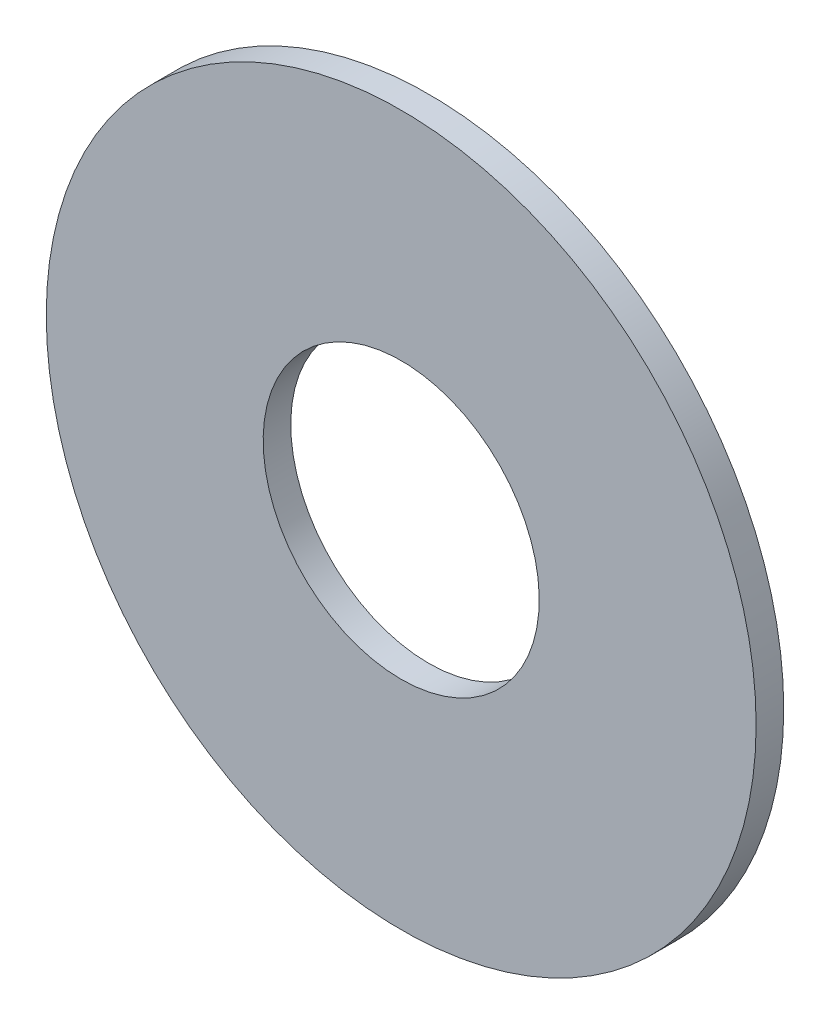
ISO-10303-21;
HEADER;
FILE_DESCRIPTION(('STEP AP214'),'2;1');
FILE_NAME('part.step','',(''),(''),'','','');
FILE_SCHEMA(('AUTOMOTIVE_DESIGN { 1 0 10303 214 1 1 1 1 }'));
ENDSEC;
DATA;
#1=APPLICATION_CONTEXT('core data for automotive mechanical design processes');
#2=APPLICATION_PROTOCOL_DEFINITION('international standard','automotive_design',2000,#1);
#3=PRODUCT_CONTEXT('',#1,'mechanical');
#4=PRODUCT('Part','Part','',(#3));
#5=PRODUCT_RELATED_PRODUCT_CATEGORY('part','',(#4));
#6=PRODUCT_DEFINITION_FORMATION('','',#4);
#7=PRODUCT_DEFINITION_CONTEXT('part definition',#1,'design');
#8=PRODUCT_DEFINITION('design','',#6,#7);
#9=PRODUCT_DEFINITION_SHAPE('','',#8);
#10=(LENGTH_UNIT() NAMED_UNIT(*) SI_UNIT(.MILLI.,.METRE.));
#11=(NAMED_UNIT(*) PLANE_ANGLE_UNIT() SI_UNIT($,.RADIAN.));
#12=(NAMED_UNIT(*) SI_UNIT($,.STERADIAN.) SOLID_ANGLE_UNIT());
#13=UNCERTAINTY_MEASURE_WITH_UNIT(LENGTH_MEASURE(1.E-05),#10,'distance_accuracy_value','');
#14=(GEOMETRIC_REPRESENTATION_CONTEXT(3) GLOBAL_UNCERTAINTY_ASSIGNED_CONTEXT((#13)) GLOBAL_UNIT_ASSIGNED_CONTEXT((#10,
#11,#12)) REPRESENTATION_CONTEXT('',''));
#15=CARTESIAN_POINT('',(0.,0.,0.));
#16=DIRECTION('',(0.,0.,1.));
#17=DIRECTION('',(1.,0.,0.));
#18=AXIS2_PLACEMENT_3D('',#15,#16,#17);
#19=CARTESIAN_POINT('',(115.,-142.1,-0.045));
#20=DIRECTION('',(0.,0.,-1.));
#21=DIRECTION('',(0.,-1.,0.));
#22=AXIS2_PLACEMENT_3D('',#19,#20,#21);
#23=CYLINDRICAL_SURFACE('',#22,0.175);
#24=CARTESIAN_POINT('',(115.,-142.1,-0.035));
#25=DIRECTION('',(0.,0.,-1.));
#26=DIRECTION('',(0.,-1.,0.));
#27=AXIS2_PLACEMENT_3D('',#24,#25,#26);
#28=CIRCLE('',#27,0.175);
#29=CARTESIAN_POINT('',(115.,-142.275,-0.035));
#30=VERTEX_POINT('',#29);
#31=EDGE_CURVE('E25',#30,#30,#28,.T.);
#32=ORIENTED_EDGE('',*,*,#31,.T.);
#33=DIRECTION('',(0.,0.,1.));
#34=VECTOR('',#33,1.);
#35=CARTESIAN_POINT('',(115.,-142.275,-0.045));
#36=LINE('',#35,#34);
#37=CARTESIAN_POINT('',(115.,-142.275,0.));
#38=VERTEX_POINT('',#37);
#39=EDGE_CURVE('E11',#30,#38,#36,.T.);
#40=ORIENTED_EDGE('',*,*,#39,.T.);
#41=CARTESIAN_POINT('',(115.,-142.1,0.));
#42=DIRECTION('',(0.,0.,-1.));
#43=DIRECTION('',(0.,-1.,0.));
#44=AXIS2_PLACEMENT_3D('',#41,#42,#43);
#45=CIRCLE('',#44,0.175);
#46=EDGE_CURVE('E69',#38,#38,#45,.T.);
#47=ORIENTED_EDGE('',*,*,#46,.F.);
#48=ORIENTED_EDGE('',*,*,#39,.F.);
#49=EDGE_LOOP('',(#32,#40,#47,#48));
#50=FACE_BOUND('',#49,.T.);
#51=ADVANCED_FACE('F17',(#50),#23,.F.);
#52=CARTESIAN_POINT('',(115.,-142.1,-0.035));
#53=DIRECTION('',(0.,0.,1.));
#54=DIRECTION('',(1.,0.,0.));
#55=AXIS2_PLACEMENT_3D('',#52,#53,#54);
#56=PLANE('',#55);
#57=ORIENTED_EDGE('',*,*,#31,.F.);
#58=EDGE_LOOP('',(#57));
#59=FACE_BOUND('',#58,.T.);
#60=CARTESIAN_POINT('',(115.,-142.1,-0.035));
#61=DIRECTION('',(0.,0.,1.));
#62=DIRECTION('',(1.,0.,0.));
#63=AXIS2_PLACEMENT_3D('',#60,#61,#62);
#64=CIRCLE('',#63,0.45);
#65=CARTESIAN_POINT('',(115.45,-142.1,-0.035));
#66=VERTEX_POINT('',#65);
#67=EDGE_CURVE('E56',#66,#66,#64,.T.);
#68=ORIENTED_EDGE('',*,*,#67,.F.);
#69=EDGE_LOOP('',(#68));
#70=FACE_BOUND('',#69,.T.);
#71=ADVANCED_FACE('F76',(#59,#70),#56,.F.);
#72=CARTESIAN_POINT('',(115.,-142.1,0.));
#73=DIRECTION('',(0.,0.,1.));
#74=DIRECTION('',(1.,0.,0.));
#75=AXIS2_PLACEMENT_3D('',#72,#73,#74);
#76=PLANE('',#75);
#77=ORIENTED_EDGE('',*,*,#46,.T.);
#78=EDGE_LOOP('',(#77));
#79=FACE_BOUND('',#78,.T.);
#80=CARTESIAN_POINT('',(115.,-142.1,0.));
#81=DIRECTION('',(0.,0.,1.));
#82=DIRECTION('',(1.,0.,0.));
#83=AXIS2_PLACEMENT_3D('',#80,#81,#82);
#84=CIRCLE('',#83,0.45);
#85=CARTESIAN_POINT('',(115.45,-142.1,0.));
#86=VERTEX_POINT('',#85);
#87=EDGE_CURVE('E54',#86,#86,#84,.T.);
#88=ORIENTED_EDGE('',*,*,#87,.T.);
#89=EDGE_LOOP('',(#88));
#90=FACE_BOUND('',#89,.T.);
#91=ADVANCED_FACE('F60',(#79,#90),#76,.T.);
#92=CARTESIAN_POINT('',(115.,-142.1,-0.035));
#93=DIRECTION('',(0.,0.,1.));
#94=DIRECTION('',(1.,0.,0.));
#95=AXIS2_PLACEMENT_3D('',#92,#93,#94);
#96=CYLINDRICAL_SURFACE('',#95,0.45);
#97=ORIENTED_EDGE('',*,*,#87,.F.);
#98=DIRECTION('',(0.,0.,1.));
#99=VECTOR('',#98,1.);
#100=CARTESIAN_POINT('',(115.45,-142.1,-0.035));
#101=LINE('',#100,#99);
#102=EDGE_CURVE('E51',#66,#86,#101,.T.);
#103=ORIENTED_EDGE('',*,*,#102,.F.);
#104=ORIENTED_EDGE('',*,*,#67,.T.);
#105=ORIENTED_EDGE('',*,*,#102,.T.);
#106=EDGE_LOOP('',(#97,#103,#104,#105));
#107=FACE_BOUND('',#106,.T.);
#108=ADVANCED_FACE('F53',(#107),#96,.T.);
#109=CLOSED_SHELL('',(#51,#71,#91,#108));
#110=MANIFOLD_SOLID_BREP('B1',#109);
#111=ADVANCED_BREP_SHAPE_REPRESENTATION('',(#18,#110),#14);
#112=SHAPE_DEFINITION_REPRESENTATION(#9,#111);
ENDSEC;
END-ISO-10303-21;
